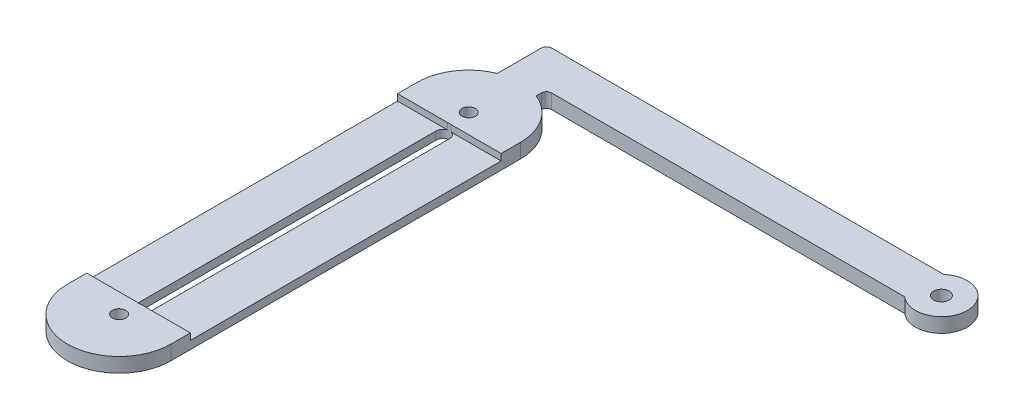
ISO-10303-21;
HEADER;
FILE_DESCRIPTION(('STEP AP214'),'2;1');
FILE_NAME('part.step','',(''),(''),'','','');
FILE_SCHEMA(('AUTOMOTIVE_DESIGN { 1 0 10303 214 1 1 1 1 }'));
ENDSEC;
DATA;
#1=APPLICATION_CONTEXT('core data for automotive mechanical design processes');
#2=APPLICATION_PROTOCOL_DEFINITION('international standard','automotive_design',2000,#1);
#3=PRODUCT_CONTEXT('',#1,'mechanical');
#4=PRODUCT('Part','Part','',(#3));
#5=PRODUCT_RELATED_PRODUCT_CATEGORY('part','',(#4));
#6=PRODUCT_DEFINITION_FORMATION('','',#4);
#7=PRODUCT_DEFINITION_CONTEXT('part definition',#1,'design');
#8=PRODUCT_DEFINITION('design','',#6,#7);
#9=PRODUCT_DEFINITION_SHAPE('','',#8);
#10=(LENGTH_UNIT() NAMED_UNIT(*) SI_UNIT(.MILLI.,.METRE.));
#11=(NAMED_UNIT(*) PLANE_ANGLE_UNIT() SI_UNIT($,.RADIAN.));
#12=(NAMED_UNIT(*) SI_UNIT($,.STERADIAN.) SOLID_ANGLE_UNIT());
#13=UNCERTAINTY_MEASURE_WITH_UNIT(LENGTH_MEASURE(1.E-05),#10,'distance_accuracy_value','');
#14=(GEOMETRIC_REPRESENTATION_CONTEXT(3) GLOBAL_UNCERTAINTY_ASSIGNED_CONTEXT((#13)) GLOBAL_UNIT_ASSIGNED_CONTEXT((#10,
#11,#12)) REPRESENTATION_CONTEXT('',''));
#15=CARTESIAN_POINT('',(0.,0.,0.));
#16=DIRECTION('',(0.,0.,1.));
#17=DIRECTION('',(1.,0.,0.));
#18=AXIS2_PLACEMENT_3D('',#15,#16,#17);
#19=CARTESIAN_POINT('',(0.,7.112,-85.725));
#20=DIRECTION('',(0.,-1.,0.));
#21=DIRECTION('',(0.,0.,-1.));
#22=AXIS2_PLACEMENT_3D('',#19,#20,#21);
#23=CYLINDRICAL_SURFACE('',#22,25.4);
#24=DIRECTION('',(0.,-1.,0.));
#25=VECTOR('',#24,1.);
#26=CARTESIAN_POINT('',(-9.52500000000002,7.112,-109.271430196529));
#27=LINE('',#26,#25);
#28=CARTESIAN_POINT('',(-9.52500000000002,0.,-109.271430196529));
#29=VERTEX_POINT('',#28);
#30=CARTESIAN_POINT('',(-9.52500000000002,7.112,-109.271430196529));
#31=VERTEX_POINT('',#30);
#32=EDGE_CURVE('E411',#29,#31,#27,.F.);
#33=ORIENTED_EDGE('',*,*,#32,.F.);
#34=CARTESIAN_POINT('',(0.,0.,-85.725));
#35=DIRECTION('',(0.,1.,0.));
#36=DIRECTION('',(0.,0.,1.));
#37=AXIS2_PLACEMENT_3D('',#34,#35,#36);
#38=CIRCLE('',#37,25.4);
#39=CARTESIAN_POINT('',(-25.4,0.,-85.725));
#40=VERTEX_POINT('',#39);
#41=EDGE_CURVE('E344',#29,#40,#38,.T.);
#42=ORIENTED_EDGE('',*,*,#41,.T.);
#43=DIRECTION('',(0.,-1.,0.));
#44=VECTOR('',#43,1.);
#45=CARTESIAN_POINT('',(-25.4,7.112,-85.725));
#46=LINE('',#45,#44);
#47=CARTESIAN_POINT('',(-25.4,7.112,-85.725));
#48=VERTEX_POINT('',#47);
#49=EDGE_CURVE('E388',#48,#40,#46,.T.);
#50=ORIENTED_EDGE('',*,*,#49,.F.);
#51=CARTESIAN_POINT('',(0.,7.112,-85.725));
#52=DIRECTION('',(0.,1.,0.));
#53=DIRECTION('',(0.,0.,1.));
#54=AXIS2_PLACEMENT_3D('',#51,#52,#53);
#55=CIRCLE('',#54,25.4);
#56=EDGE_CURVE('E350',#31,#48,#55,.T.);
#57=ORIENTED_EDGE('',*,*,#56,.F.);
#58=EDGE_LOOP('',(#33,#42,#50,#57));
#59=FACE_BOUND('',#58,.T.);
#60=ADVANCED_FACE('F39',(#59),#23,.T.);
#61=DIRECTION('',(0.,-1.,0.));
#62=VECTOR('',#61,1.);
#63=CARTESIAN_POINT('',(9.52500000000001,7.112,-109.271430196529));
#64=LINE('',#63,#62);
#65=CARTESIAN_POINT('',(9.52500000000001,7.112,-109.271430196529));
#66=VERTEX_POINT('',#65);
#67=CARTESIAN_POINT('',(9.52500000000001,0.,-109.271430196529));
#68=VERTEX_POINT('',#67);
#69=EDGE_CURVE('E408',#66,#68,#64,.T.);
#70=ORIENTED_EDGE('',*,*,#69,.F.);
#71=CARTESIAN_POINT('',(25.4,7.112,-85.725));
#72=VERTEX_POINT('',#71);
#73=EDGE_CURVE('E345',#72,#66,#55,.T.);
#74=ORIENTED_EDGE('',*,*,#73,.F.);
#75=DIRECTION('',(0.,-1.,0.));
#76=VECTOR('',#75,1.);
#77=CARTESIAN_POINT('',(25.4,7.112,-85.725));
#78=LINE('',#77,#76);
#79=CARTESIAN_POINT('',(25.4,0.,-85.725));
#80=VERTEX_POINT('',#79);
#81=EDGE_CURVE('E363',#72,#80,#78,.T.);
#82=ORIENTED_EDGE('',*,*,#81,.T.);
#83=EDGE_CURVE('E364',#80,#68,#38,.T.);
#84=ORIENTED_EDGE('',*,*,#83,.T.);
#85=EDGE_LOOP('',(#70,#74,#82,#84));
#86=FACE_BOUND('',#85,.T.);
#87=ADVANCED_FACE('F541',(#86),#23,.T.);
#88=CARTESIAN_POINT('',(0.,7.112,-85.725));
#89=DIRECTION('',(0.,1.,0.));
#90=DIRECTION('',(0.,0.,1.));
#91=AXIS2_PLACEMENT_3D('',#88,#89,#90);
#92=PLANE('',#91);
#93=DIRECTION('',(1.,0.,0.));
#94=VECTOR('',#93,1.);
#95=CARTESIAN_POINT('',(25.4,7.112,76.2));
#96=LINE('',#95,#94);
#97=CARTESIAN_POINT('',(-25.4,7.112,76.2));
#98=VERTEX_POINT('',#97);
#99=CARTESIAN_POINT('',(-0.906961410424909,7.112,76.2));
#100=VERTEX_POINT('',#99);
#101=EDGE_CURVE('E249',#98,#100,#96,.T.);
#102=ORIENTED_EDGE('',*,*,#101,.F.);
#103=DIRECTION('',(0.,0.,1.));
#104=VECTOR('',#103,1.);
#105=CARTESIAN_POINT('',(-25.4,7.112,-85.725));
#106=LINE('',#105,#104);
#107=CARTESIAN_POINT('',(-25.4,7.112,85.725));
#108=VERTEX_POINT('',#107);
#109=EDGE_CURVE('E349',#98,#108,#106,.T.);
#110=ORIENTED_EDGE('',*,*,#109,.T.);
#111=CARTESIAN_POINT('',(0.,7.112,85.725));
#112=DIRECTION('',(0.,1.,0.));
#113=DIRECTION('',(0.,0.,1.));
#114=AXIS2_PLACEMENT_3D('',#111,#112,#113);
#115=CIRCLE('',#114,25.4);
#116=CARTESIAN_POINT('',(25.4,7.112,85.725));
#117=VERTEX_POINT('',#116);
#118=EDGE_CURVE('E355',#108,#117,#115,.T.);
#119=ORIENTED_EDGE('',*,*,#118,.T.);
#120=DIRECTION('',(0.,0.,-1.));
#121=VECTOR('',#120,1.);
#122=CARTESIAN_POINT('',(25.4,7.112,-85.725));
#123=LINE('',#122,#121);
#124=CARTESIAN_POINT('',(25.4,7.112,76.2));
#125=VERTEX_POINT('',#124);
#126=EDGE_CURVE('E359',#117,#125,#123,.T.);
#127=ORIENTED_EDGE('',*,*,#126,.T.);
#128=CARTESIAN_POINT('',(0.906961410424944,7.112,76.2));
#129=VERTEX_POINT('',#128);
#130=EDGE_CURVE('E265',#129,#125,#96,.T.);
#131=ORIENTED_EDGE('',*,*,#130,.F.);
#132=CARTESIAN_POINT('',(0.,7.112,73.025));
#133=DIRECTION('',(0.,1.,0.));
#134=DIRECTION('',(0.,0.,1.));
#135=AXIS2_PLACEMENT_3D('',#132,#133,#134);
#136=CIRCLE('',#135,3.302);
#137=EDGE_CURVE('E313',#100,#129,#136,.T.);
#138=ORIENTED_EDGE('',*,*,#137,.F.);
#139=EDGE_LOOP('',(#102,#110,#119,#127,#131,#138));
#140=FACE_BOUND('',#139,.T.);
#141=CARTESIAN_POINT('',(0.,7.112,85.725));
#142=DIRECTION('',(0.,1.,0.));
#143=DIRECTION('',(0.,0.,1.));
#144=AXIS2_PLACEMENT_3D('',#141,#142,#143);
#145=CIRCLE('',#144,3.302);
#146=CARTESIAN_POINT('',(0.,7.112,89.027));
#147=VERTEX_POINT('',#146);
#148=EDGE_CURVE('E301',#147,#147,#145,.T.);
#149=ORIENTED_EDGE('',*,*,#148,.F.);
#150=EDGE_LOOP('',(#149));
#151=FACE_BOUND('',#150,.T.);
#152=ADVANCED_FACE('F470',(#140,#151),#92,.T.);
#153=DIRECTION('',(-1.,0.,0.));
#154=VECTOR('',#153,1.);
#155=CARTESIAN_POINT('',(-9.52500000000002,7.11200000000001,-133.35));
#156=LINE('',#155,#154);
#157=CARTESIAN_POINT('',(185.27473958737,7.11200000000001,-133.35));
#158=VERTEX_POINT('',#157);
#159=CARTESIAN_POINT('',(-6.98500000000002,7.11200000000001,-133.35));
#160=VERTEX_POINT('',#159);
#161=EDGE_CURVE('E454',#158,#160,#156,.T.);
#162=ORIENTED_EDGE('',*,*,#161,.T.);
#163=CARTESIAN_POINT('',(-6.98500000000002,7.11200000000001,-130.81));
#164=DIRECTION('',(0.,1.,0.));
#165=DIRECTION('',(0.,0.,1.));
#166=AXIS2_PLACEMENT_3D('',#163,#164,#165);
#167=CIRCLE('',#166,2.54);
#168=CARTESIAN_POINT('',(-9.52500000000002,7.11200000000001,-130.81));
#169=VERTEX_POINT('',#168);
#170=EDGE_CURVE('E428',#160,#169,#167,.T.);
#171=ORIENTED_EDGE('',*,*,#170,.T.);
#172=DIRECTION('',(0.,0.,1.));
#173=VECTOR('',#172,1.);
#174=CARTESIAN_POINT('',(-9.52500000000002,7.11200000000001,-85.725));
#175=LINE('',#174,#173);
#176=EDGE_CURVE('E243',#169,#31,#175,.T.);
#177=ORIENTED_EDGE('',*,*,#176,.T.);
#178=ORIENTED_EDGE('',*,*,#56,.T.);
#179=CARTESIAN_POINT('',(-25.4,7.112,-76.2));
#180=VERTEX_POINT('',#179);
#181=EDGE_CURVE('E351',#48,#180,#106,.T.);
#182=ORIENTED_EDGE('',*,*,#181,.T.);
#183=DIRECTION('',(-1.,0.,0.));
#184=VECTOR('',#183,1.);
#185=CARTESIAN_POINT('',(25.4,7.112,-76.2));
#186=LINE('',#185,#184);
#187=CARTESIAN_POINT('',(-0.906961410424953,7.112,-76.2));
#188=VERTEX_POINT('',#187);
#189=EDGE_CURVE('E222',#188,#180,#186,.T.);
#190=ORIENTED_EDGE('',*,*,#189,.F.);
#191=CARTESIAN_POINT('',(0.,7.112,-73.025));
#192=DIRECTION('',(0.,1.,0.));
#193=DIRECTION('',(0.,0.,1.));
#194=AXIS2_PLACEMENT_3D('',#191,#192,#193);
#195=CIRCLE('',#194,3.302);
#196=CARTESIAN_POINT('',(0.906961410424899,7.112,-76.2));
#197=VERTEX_POINT('',#196);
#198=EDGE_CURVE('E309',#197,#188,#195,.T.);
#199=ORIENTED_EDGE('',*,*,#198,.F.);
#200=CARTESIAN_POINT('',(25.4,7.112,-76.2));
#201=VERTEX_POINT('',#200);
#202=EDGE_CURVE('E262',#201,#197,#186,.T.);
#203=ORIENTED_EDGE('',*,*,#202,.F.);
#204=EDGE_CURVE('E358',#201,#72,#123,.T.);
#205=ORIENTED_EDGE('',*,*,#204,.T.);
#206=ORIENTED_EDGE('',*,*,#73,.T.);
#207=DIRECTION('',(0.,0.,-1.));
#208=VECTOR('',#207,1.);
#209=CARTESIAN_POINT('',(9.52500000000001,7.11200000000001,-114.3));
#210=LINE('',#209,#208);
#211=CARTESIAN_POINT('',(9.52500000000001,7.11200000000001,-111.76));
#212=VERTEX_POINT('',#211);
#213=EDGE_CURVE('E448',#66,#212,#210,.T.);
#214=ORIENTED_EDGE('',*,*,#213,.T.);
#215=CARTESIAN_POINT('',(12.065,7.11200000000001,-111.76));
#216=DIRECTION('',(0.,1.,0.));
#217=DIRECTION('',(0.,0.,1.));
#218=AXIS2_PLACEMENT_3D('',#215,#216,#217);
#219=CIRCLE('',#218,2.54);
#220=CARTESIAN_POINT('',(12.065,7.11200000000001,-114.3));
#221=VERTEX_POINT('',#220);
#222=EDGE_CURVE('E11',#212,#221,#219,.F.);
#223=ORIENTED_EDGE('',*,*,#222,.T.);
#224=DIRECTION('',(1.,0.,0.));
#225=VECTOR('',#224,1.);
#226=CARTESIAN_POINT('',(185.27473958737,7.11200000000001,-114.3));
#227=LINE('',#226,#225);
#228=CARTESIAN_POINT('',(185.27473958737,7.11200000000001,-114.3));
#229=VERTEX_POINT('',#228);
#230=EDGE_CURVE('E447',#221,#229,#227,.T.);
#231=ORIENTED_EDGE('',*,*,#230,.T.);
#232=CARTESIAN_POINT('',(193.675,7.11200000000001,-123.825));
#233=DIRECTION('',(0.,1.,0.));
#234=DIRECTION('',(0.,0.,1.));
#235=AXIS2_PLACEMENT_3D('',#232,#233,#234);
#236=CIRCLE('',#235,12.7);
#237=EDGE_CURVE('E220',#229,#158,#236,.T.);
#238=ORIENTED_EDGE('',*,*,#237,.T.);
#239=EDGE_LOOP('',(#162,#171,#177,#178,#182,#190,#199,#203,#205,#206,#214,#223,#231,#238));
#240=FACE_BOUND('',#239,.T.);
#241=CARTESIAN_POINT('',(193.675,7.11200000000001,-123.825));
#242=DIRECTION('',(0.,1.,0.));
#243=DIRECTION('',(0.,0.,1.));
#244=AXIS2_PLACEMENT_3D('',#241,#242,#243);
#245=CIRCLE('',#244,3.81000000000001);
#246=CARTESIAN_POINT('',(193.675,7.11200000000001,-120.015));
#247=VERTEX_POINT('',#246);
#248=EDGE_CURVE('E239',#247,#247,#245,.T.);
#249=ORIENTED_EDGE('',*,*,#248,.F.);
#250=EDGE_LOOP('',(#249));
#251=FACE_BOUND('',#250,.T.);
#252=CARTESIAN_POINT('',(0.,7.112,-85.725));
#253=DIRECTION('',(0.,1.,0.));
#254=DIRECTION('',(0.,0.,1.));
#255=AXIS2_PLACEMENT_3D('',#252,#253,#254);
#256=CIRCLE('',#255,3.302);
#257=CARTESIAN_POINT('',(0.,7.112,-82.423));
#258=VERTEX_POINT('',#257);
#259=EDGE_CURVE('E292',#258,#258,#256,.T.);
#260=ORIENTED_EDGE('',*,*,#259,.F.);
#261=EDGE_LOOP('',(#260));
#262=FACE_BOUND('',#261,.T.);
#263=ADVANCED_FACE('F445',(#240,#251,#262),#92,.T.);
#264=CARTESIAN_POINT('',(0.,0.,-85.725));
#265=DIRECTION('',(0.,1.,0.));
#266=DIRECTION('',(0.,0.,1.));
#267=AXIS2_PLACEMENT_3D('',#264,#265,#266);
#268=PLANE('',#267);
#269=DIRECTION('',(0.,0.,1.));
#270=VECTOR('',#269,1.);
#271=CARTESIAN_POINT('',(-9.52500000000002,0.,-85.725));
#272=LINE('',#271,#270);
#273=CARTESIAN_POINT('',(-9.52500000000002,0.,-130.81));
#274=VERTEX_POINT('',#273);
#275=EDGE_CURVE('E231',#274,#29,#272,.T.);
#276=ORIENTED_EDGE('',*,*,#275,.F.);
#277=CARTESIAN_POINT('',(-6.98500000000002,0.,-130.81));
#278=DIRECTION('',(0.,1.,0.));
#279=DIRECTION('',(0.,0.,1.));
#280=AXIS2_PLACEMENT_3D('',#277,#278,#279);
#281=CIRCLE('',#280,2.54);
#282=CARTESIAN_POINT('',(-6.98500000000002,0.,-133.35));
#283=VERTEX_POINT('',#282);
#284=EDGE_CURVE('E63',#274,#283,#281,.F.);
#285=ORIENTED_EDGE('',*,*,#284,.T.);
#286=DIRECTION('',(-1.,0.,0.));
#287=VECTOR('',#286,1.);
#288=CARTESIAN_POINT('',(-9.52500000000002,0.,-133.35));
#289=LINE('',#288,#287);
#290=CARTESIAN_POINT('',(185.27473958737,0.,-133.35));
#291=VERTEX_POINT('',#290);
#292=EDGE_CURVE('E227',#291,#283,#289,.T.);
#293=ORIENTED_EDGE('',*,*,#292,.F.);
#294=CARTESIAN_POINT('',(193.675,0.,-123.825));
#295=DIRECTION('',(0.,1.,0.));
#296=DIRECTION('',(0.,0.,1.));
#297=AXIS2_PLACEMENT_3D('',#294,#295,#296);
#298=CIRCLE('',#297,12.7);
#299=CARTESIAN_POINT('',(185.27473958737,0.,-114.3));
#300=VERTEX_POINT('',#299);
#301=EDGE_CURVE('E211',#300,#291,#298,.T.);
#302=ORIENTED_EDGE('',*,*,#301,.F.);
#303=DIRECTION('',(1.,0.,0.));
#304=VECTOR('',#303,1.);
#305=CARTESIAN_POINT('',(185.27473958737,0.,-114.3));
#306=LINE('',#305,#304);
#307=CARTESIAN_POINT('',(12.0650000000001,0.,-114.3));
#308=VERTEX_POINT('',#307);
#309=EDGE_CURVE('E202',#308,#300,#306,.T.);
#310=ORIENTED_EDGE('',*,*,#309,.F.);
#311=CARTESIAN_POINT('',(12.065,0.,-111.76));
#312=DIRECTION('',(0.,1.,0.));
#313=DIRECTION('',(0.,0.,1.));
#314=AXIS2_PLACEMENT_3D('',#311,#312,#313);
#315=CIRCLE('',#314,2.54);
#316=CARTESIAN_POINT('',(9.52500000000001,0.,-111.76));
#317=VERTEX_POINT('',#316);
#318=EDGE_CURVE('E48',#308,#317,#315,.T.);
#319=ORIENTED_EDGE('',*,*,#318,.T.);
#320=DIRECTION('',(0.,0.,-1.));
#321=VECTOR('',#320,1.);
#322=CARTESIAN_POINT('',(9.52500000000001,0.,-114.3));
#323=LINE('',#322,#321);
#324=EDGE_CURVE('E212',#68,#317,#323,.T.);
#325=ORIENTED_EDGE('',*,*,#324,.F.);
#326=ORIENTED_EDGE('',*,*,#83,.F.);
#327=DIRECTION('',(0.,0.,-1.));
#328=VECTOR('',#327,1.);
#329=CARTESIAN_POINT('',(25.4,0.,-85.725));
#330=LINE('',#329,#328);
#331=CARTESIAN_POINT('',(25.4,0.,85.725));
#332=VERTEX_POINT('',#331);
#333=EDGE_CURVE('E374',#332,#80,#330,.T.);
#334=ORIENTED_EDGE('',*,*,#333,.F.);
#335=CARTESIAN_POINT('',(0.,0.,85.725));
#336=DIRECTION('',(0.,1.,0.));
#337=DIRECTION('',(0.,0.,1.));
#338=AXIS2_PLACEMENT_3D('',#335,#336,#337);
#339=CIRCLE('',#338,25.4);
#340=CARTESIAN_POINT('',(-25.4,0.,85.725));
#341=VERTEX_POINT('',#340);
#342=EDGE_CURVE('E371',#341,#332,#339,.T.);
#343=ORIENTED_EDGE('',*,*,#342,.F.);
#344=DIRECTION('',(0.,0.,1.));
#345=VECTOR('',#344,1.);
#346=CARTESIAN_POINT('',(-25.4,0.,-85.725));
#347=LINE('',#346,#345);
#348=EDGE_CURVE('E368',#40,#341,#347,.T.);
#349=ORIENTED_EDGE('',*,*,#348,.F.);
#350=ORIENTED_EDGE('',*,*,#41,.F.);
#351=EDGE_LOOP('',(#276,#285,#293,#302,#310,#319,#325,#326,#334,#343,#349,#350));
#352=FACE_BOUND('',#351,.T.);
#353=CARTESIAN_POINT('',(193.675,0.,-123.825));
#354=DIRECTION('',(0.,1.,0.));
#355=DIRECTION('',(0.,0.,1.));
#356=AXIS2_PLACEMENT_3D('',#353,#354,#355);
#357=CIRCLE('',#356,3.81000000000001);
#358=CARTESIAN_POINT('',(193.675,0.,-120.015));
#359=VERTEX_POINT('',#358);
#360=EDGE_CURVE('E441',#359,#359,#357,.T.);
#361=ORIENTED_EDGE('',*,*,#360,.T.);
#362=EDGE_LOOP('',(#361));
#363=FACE_BOUND('',#362,.T.);
#364=CARTESIAN_POINT('',(0.,0.,-85.725));
#365=DIRECTION('',(0.,1.,0.));
#366=DIRECTION('',(0.,0.,1.));
#367=AXIS2_PLACEMENT_3D('',#364,#365,#366);
#368=CIRCLE('',#367,3.302);
#369=CARTESIAN_POINT('',(0.,0.,-82.423));
#370=VERTEX_POINT('',#369);
#371=EDGE_CURVE('E297',#370,#370,#368,.T.);
#372=ORIENTED_EDGE('',*,*,#371,.T.);
#373=EDGE_LOOP('',(#372));
#374=FACE_BOUND('',#373,.T.);
#375=CARTESIAN_POINT('',(0.,0.,85.725));
#376=DIRECTION('',(0.,1.,0.));
#377=DIRECTION('',(0.,0.,1.));
#378=AXIS2_PLACEMENT_3D('',#375,#376,#377);
#379=CIRCLE('',#378,3.302);
#380=CARTESIAN_POINT('',(0.,0.,89.027));
#381=VERTEX_POINT('',#380);
#382=EDGE_CURVE('E296',#381,#381,#379,.T.);
#383=ORIENTED_EDGE('',*,*,#382,.T.);
#384=EDGE_LOOP('',(#383));
#385=FACE_BOUND('',#384,.T.);
#386=CARTESIAN_POINT('',(0.,0.,-73.025));
#387=DIRECTION('',(0.,1.,0.));
#388=DIRECTION('',(0.,0.,1.));
#389=AXIS2_PLACEMENT_3D('',#386,#387,#388);
#390=CIRCLE('',#389,3.302);
#391=CARTESIAN_POINT('',(3.30199999999997,0.,-73.025));
#392=VERTEX_POINT('',#391);
#393=CARTESIAN_POINT('',(-3.30200000000002,0.,-73.025));
#394=VERTEX_POINT('',#393);
#395=EDGE_CURVE('E305',#392,#394,#390,.T.);
#396=ORIENTED_EDGE('',*,*,#395,.T.);
#397=DIRECTION('',(0.,0.,1.));
#398=VECTOR('',#397,1.);
#399=CARTESIAN_POINT('',(-3.30200000000002,0.,-73.025));
#400=LINE('',#399,#398);
#401=CARTESIAN_POINT('',(-3.30199999999998,0.,73.025));
#402=VERTEX_POINT('',#401);
#403=EDGE_CURVE('E322',#394,#402,#400,.T.);
#404=ORIENTED_EDGE('',*,*,#403,.T.);
#405=CARTESIAN_POINT('',(0.,0.,73.025));
#406=DIRECTION('',(0.,1.,0.));
#407=DIRECTION('',(0.,0.,1.));
#408=AXIS2_PLACEMENT_3D('',#405,#406,#407);
#409=CIRCLE('',#408,3.302);
#410=CARTESIAN_POINT('',(3.30200000000002,0.,73.025));
#411=VERTEX_POINT('',#410);
#412=EDGE_CURVE('E326',#402,#411,#409,.T.);
#413=ORIENTED_EDGE('',*,*,#412,.T.);
#414=DIRECTION('',(0.,0.,-1.));
#415=VECTOR('',#414,1.);
#416=CARTESIAN_POINT('',(3.30199999999997,0.,-73.025));
#417=LINE('',#416,#415);
#418=EDGE_CURVE('E314',#411,#392,#417,.T.);
#419=ORIENTED_EDGE('',*,*,#418,.T.);
#420=EDGE_LOOP('',(#396,#404,#413,#419));
#421=FACE_BOUND('',#420,.T.);
#422=ADVANCED_FACE('F225',(#352,#363,#374,#385,#421),#268,.F.);
#423=CARTESIAN_POINT('',(-25.4,7.112,-85.725));
#424=DIRECTION('',(1.,0.,0.));
#425=DIRECTION('',(0.,0.,-1.));
#426=AXIS2_PLACEMENT_3D('',#423,#424,#425);
#427=PLANE('',#426);
#428=ORIENTED_EDGE('',*,*,#109,.F.);
#429=DIRECTION('',(0.,1.,0.));
#430=VECTOR('',#429,1.);
#431=CARTESIAN_POINT('',(-25.4,3.937,76.2));
#432=LINE('',#431,#430);
#433=CARTESIAN_POINT('',(-25.4,3.937,76.2));
#434=VERTEX_POINT('',#433);
#435=EDGE_CURVE('E273',#434,#98,#432,.T.);
#436=ORIENTED_EDGE('',*,*,#435,.F.);
#437=DIRECTION('',(0.,0.,1.));
#438=VECTOR('',#437,1.);
#439=CARTESIAN_POINT('',(-25.4,3.937,-76.2));
#440=LINE('',#439,#438);
#441=CARTESIAN_POINT('',(-25.4,3.937,-76.2));
#442=VERTEX_POINT('',#441);
#443=EDGE_CURVE('E254',#442,#434,#440,.T.);
#444=ORIENTED_EDGE('',*,*,#443,.F.);
#445=DIRECTION('',(0.,1.,0.));
#446=VECTOR('',#445,1.);
#447=CARTESIAN_POINT('',(-25.4,3.937,-76.2));
#448=LINE('',#447,#446);
#449=EDGE_CURVE('E276',#442,#180,#448,.T.);
#450=ORIENTED_EDGE('',*,*,#449,.T.);
#451=ORIENTED_EDGE('',*,*,#181,.F.);
#452=ORIENTED_EDGE('',*,*,#49,.T.);
#453=ORIENTED_EDGE('',*,*,#348,.T.);
#454=DIRECTION('',(0.,-1.,0.));
#455=VECTOR('',#454,1.);
#456=CARTESIAN_POINT('',(-25.4,7.112,85.725));
#457=LINE('',#456,#455);
#458=EDGE_CURVE('E384',#108,#341,#457,.T.);
#459=ORIENTED_EDGE('',*,*,#458,.F.);
#460=EDGE_LOOP('',(#428,#436,#444,#450,#451,#452,#453,#459));
#461=FACE_BOUND('',#460,.T.);
#462=ADVANCED_FACE('F483',(#461),#427,.F.);
#463=CARTESIAN_POINT('',(0.,7.112,85.725));
#464=DIRECTION('',(0.,-1.,0.));
#465=DIRECTION('',(0.,0.,-1.));
#466=AXIS2_PLACEMENT_3D('',#463,#464,#465);
#467=CYLINDRICAL_SURFACE('',#466,25.4);
#468=ORIENTED_EDGE('',*,*,#342,.T.);
#469=DIRECTION('',(0.,-1.,0.));
#470=VECTOR('',#469,1.);
#471=CARTESIAN_POINT('',(25.4,7.112,85.725));
#472=LINE('',#471,#470);
#473=EDGE_CURVE('E380',#117,#332,#472,.T.);
#474=ORIENTED_EDGE('',*,*,#473,.F.);
#475=ORIENTED_EDGE('',*,*,#118,.F.);
#476=ORIENTED_EDGE('',*,*,#458,.T.);
#477=EDGE_LOOP('',(#468,#474,#475,#476));
#478=FACE_BOUND('',#477,.T.);
#479=ADVANCED_FACE('F547',(#478),#467,.T.);
#480=CARTESIAN_POINT('',(25.4,7.112,-85.725));
#481=DIRECTION('',(-1.,0.,0.));
#482=DIRECTION('',(0.,0.,1.));
#483=AXIS2_PLACEMENT_3D('',#480,#481,#482);
#484=PLANE('',#483);
#485=DIRECTION('',(0.,0.,-1.));
#486=VECTOR('',#485,1.);
#487=CARTESIAN_POINT('',(25.4,3.937,-76.2));
#488=LINE('',#487,#486);
#489=CARTESIAN_POINT('',(25.4,3.937,76.2));
#490=VERTEX_POINT('',#489);
#491=CARTESIAN_POINT('',(25.4,3.937,-76.2));
#492=VERTEX_POINT('',#491);
#493=EDGE_CURVE('E244',#490,#492,#488,.T.);
#494=ORIENTED_EDGE('',*,*,#493,.F.);
#495=DIRECTION('',(0.,1.,0.));
#496=VECTOR('',#495,1.);
#497=CARTESIAN_POINT('',(25.4,3.937,76.2));
#498=LINE('',#497,#496);
#499=EDGE_CURVE('E268',#490,#125,#498,.T.);
#500=ORIENTED_EDGE('',*,*,#499,.T.);
#501=ORIENTED_EDGE('',*,*,#126,.F.);
#502=ORIENTED_EDGE('',*,*,#473,.T.);
#503=ORIENTED_EDGE('',*,*,#333,.T.);
#504=ORIENTED_EDGE('',*,*,#81,.F.);
#505=ORIENTED_EDGE('',*,*,#204,.F.);
#506=DIRECTION('',(0.,1.,0.));
#507=VECTOR('',#506,1.);
#508=CARTESIAN_POINT('',(25.4,3.937,-76.2));
#509=LINE('',#508,#507);
#510=EDGE_CURVE('E261',#492,#201,#509,.T.);
#511=ORIENTED_EDGE('',*,*,#510,.F.);
#512=EDGE_LOOP('',(#494,#500,#501,#502,#503,#504,#505,#511));
#513=FACE_BOUND('',#512,.T.);
#514=ADVANCED_FACE('F538',(#513),#484,.F.);
#515=CARTESIAN_POINT('',(0.,7.112,-73.025));
#516=DIRECTION('',(0.,-1.,0.));
#517=DIRECTION('',(0.,0.,-1.));
#518=AXIS2_PLACEMENT_3D('',#515,#516,#517);
#519=CYLINDRICAL_SURFACE('',#518,3.302);
#520=DIRECTION('',(0.,-1.,0.));
#521=VECTOR('',#520,1.);
#522=CARTESIAN_POINT('',(0.906961410424924,7.112,-76.2));
#523=LINE('',#522,#521);
#524=CARTESIAN_POINT('',(0.906961410424899,3.937,-76.2));
#525=VERTEX_POINT('',#524);
#526=EDGE_CURVE('E405',#197,#525,#523,.T.);
#527=ORIENTED_EDGE('',*,*,#526,.F.);
#528=ORIENTED_EDGE('',*,*,#198,.T.);
#529=DIRECTION('',(0.,-1.,0.));
#530=VECTOR('',#529,1.);
#531=CARTESIAN_POINT('',(-0.906961410424977,7.112,-76.2));
#532=LINE('',#531,#530);
#533=CARTESIAN_POINT('',(-0.906961410424953,3.937,-76.2));
#534=VERTEX_POINT('',#533);
#535=EDGE_CURVE('E402',#534,#188,#532,.F.);
#536=ORIENTED_EDGE('',*,*,#535,.F.);
#537=CARTESIAN_POINT('',(0.,3.937,-73.025));
#538=DIRECTION('',(0.,-1.,0.));
#539=DIRECTION('',(0.,0.,-1.));
#540=AXIS2_PLACEMENT_3D('',#537,#538,#539);
#541=CIRCLE('',#540,3.302);
#542=CARTESIAN_POINT('',(-3.30200000000002,3.937,-73.025));
#543=VERTEX_POINT('',#542);
#544=EDGE_CURVE('E288',#543,#534,#541,.T.);
#545=ORIENTED_EDGE('',*,*,#544,.F.);
#546=DIRECTION('',(0.,-1.,0.));
#547=VECTOR('',#546,1.);
#548=CARTESIAN_POINT('',(-3.30200000000002,7.112,-73.025));
#549=LINE('',#548,#547);
#550=EDGE_CURVE('E341',#543,#394,#549,.T.);
#551=ORIENTED_EDGE('',*,*,#550,.T.);
#552=ORIENTED_EDGE('',*,*,#395,.F.);
#553=DIRECTION('',(0.,-1.,0.));
#554=VECTOR('',#553,1.);
#555=CARTESIAN_POINT('',(3.30199999999997,7.112,-73.025));
#556=LINE('',#555,#554);
#557=CARTESIAN_POINT('',(3.30199999999997,3.937,-73.025));
#558=VERTEX_POINT('',#557);
#559=EDGE_CURVE('E318',#558,#392,#556,.T.);
#560=ORIENTED_EDGE('',*,*,#559,.F.);
#561=EDGE_CURVE('E284',#525,#558,#541,.T.);
#562=ORIENTED_EDGE('',*,*,#561,.F.);
#563=EDGE_LOOP('',(#527,#528,#536,#545,#551,#552,#560,#562));
#564=FACE_BOUND('',#563,.T.);
#565=ADVANCED_FACE('F493',(#564),#519,.F.);
#566=CARTESIAN_POINT('',(-3.30200000000002,7.112,-73.025));
#567=DIRECTION('',(1.,0.,0.));
#568=DIRECTION('',(0.,0.,-1.));
#569=AXIS2_PLACEMENT_3D('',#566,#567,#568);
#570=PLANE('',#569);
#571=DIRECTION('',(0.,0.,-1.));
#572=VECTOR('',#571,1.);
#573=CARTESIAN_POINT('',(-3.30200000000002,3.937,-73.025));
#574=LINE('',#573,#572);
#575=CARTESIAN_POINT('',(-3.30199999999998,3.937,73.025));
#576=VERTEX_POINT('',#575);
#577=EDGE_CURVE('E289',#576,#543,#574,.T.);
#578=ORIENTED_EDGE('',*,*,#577,.F.);
#579=DIRECTION('',(0.,-1.,0.));
#580=VECTOR('',#579,1.);
#581=CARTESIAN_POINT('',(-3.30199999999998,7.112,73.025));
#582=LINE('',#581,#580);
#583=EDGE_CURVE('E338',#576,#402,#582,.T.);
#584=ORIENTED_EDGE('',*,*,#583,.T.);
#585=ORIENTED_EDGE('',*,*,#403,.F.);
#586=ORIENTED_EDGE('',*,*,#550,.F.);
#587=EDGE_LOOP('',(#578,#584,#585,#586));
#588=FACE_BOUND('',#587,.T.);
#589=ADVANCED_FACE('F500',(#588),#570,.T.);
#590=CARTESIAN_POINT('',(0.,7.112,73.025));
#591=DIRECTION('',(0.,-1.,0.));
#592=DIRECTION('',(0.,0.,-1.));
#593=AXIS2_PLACEMENT_3D('',#590,#591,#592);
#594=CYLINDRICAL_SURFACE('',#593,3.302);
#595=DIRECTION('',(0.,-1.,0.));
#596=VECTOR('',#595,1.);
#597=CARTESIAN_POINT('',(-0.906961410424933,7.112,76.2));
#598=LINE('',#597,#596);
#599=CARTESIAN_POINT('',(-0.906961410424909,3.937,76.2));
#600=VERTEX_POINT('',#599);
#601=EDGE_CURVE('E398',#100,#600,#598,.T.);
#602=ORIENTED_EDGE('',*,*,#601,.F.);
#603=ORIENTED_EDGE('',*,*,#137,.T.);
#604=DIRECTION('',(0.,-1.,0.));
#605=VECTOR('',#604,1.);
#606=CARTESIAN_POINT('',(0.906961410424968,7.112,76.2));
#607=LINE('',#606,#605);
#608=CARTESIAN_POINT('',(0.906961410424944,3.937,76.2));
#609=VERTEX_POINT('',#608);
#610=EDGE_CURVE('E395',#609,#129,#607,.F.);
#611=ORIENTED_EDGE('',*,*,#610,.F.);
#612=CARTESIAN_POINT('',(0.,3.937,73.025));
#613=DIRECTION('',(0.,-1.,0.));
#614=DIRECTION('',(0.,0.,-1.));
#615=AXIS2_PLACEMENT_3D('',#612,#613,#614);
#616=CIRCLE('',#615,3.302);
#617=CARTESIAN_POINT('',(3.30200000000002,3.937,73.025));
#618=VERTEX_POINT('',#617);
#619=EDGE_CURVE('E272',#618,#609,#616,.T.);
#620=ORIENTED_EDGE('',*,*,#619,.F.);
#621=DIRECTION('',(0.,-1.,0.));
#622=VECTOR('',#621,1.);
#623=CARTESIAN_POINT('',(3.30200000000002,7.112,73.025));
#624=LINE('',#623,#622);
#625=EDGE_CURVE('E335',#618,#411,#624,.T.);
#626=ORIENTED_EDGE('',*,*,#625,.T.);
#627=ORIENTED_EDGE('',*,*,#412,.F.);
#628=ORIENTED_EDGE('',*,*,#583,.F.);
#629=EDGE_CURVE('E285',#600,#576,#616,.T.);
#630=ORIENTED_EDGE('',*,*,#629,.F.);
#631=EDGE_LOOP('',(#602,#603,#611,#620,#626,#627,#628,#630));
#632=FACE_BOUND('',#631,.T.);
#633=ADVANCED_FACE('F506',(#632),#594,.F.);
#634=CARTESIAN_POINT('',(3.30199999999997,7.112,-73.025));
#635=DIRECTION('',(-1.,0.,0.));
#636=DIRECTION('',(0.,0.,1.));
#637=AXIS2_PLACEMENT_3D('',#634,#635,#636);
#638=PLANE('',#637);
#639=DIRECTION('',(0.,0.,1.));
#640=VECTOR('',#639,1.);
#641=CARTESIAN_POINT('',(3.30199999999997,3.937,-73.025));
#642=LINE('',#641,#640);
#643=EDGE_CURVE('E392',#558,#618,#642,.T.);
#644=ORIENTED_EDGE('',*,*,#643,.F.);
#645=ORIENTED_EDGE('',*,*,#559,.T.);
#646=ORIENTED_EDGE('',*,*,#418,.F.);
#647=ORIENTED_EDGE('',*,*,#625,.F.);
#648=EDGE_LOOP('',(#644,#645,#646,#647));
#649=FACE_BOUND('',#648,.T.);
#650=ADVANCED_FACE('F512',(#649),#638,.T.);
#651=CARTESIAN_POINT('',(0.,7.112,85.725));
#652=DIRECTION('',(0.,-1.,0.));
#653=DIRECTION('',(0.,0.,-1.));
#654=AXIS2_PLACEMENT_3D('',#651,#652,#653);
#655=CYLINDRICAL_SURFACE('',#654,3.302);
#656=ORIENTED_EDGE('',*,*,#148,.T.);
#657=EDGE_LOOP('',(#656));
#658=FACE_BOUND('',#657,.T.);
#659=ORIENTED_EDGE('',*,*,#382,.F.);
#660=EDGE_LOOP('',(#659));
#661=FACE_BOUND('',#660,.T.);
#662=ADVANCED_FACE('F478',(#658,#661),#655,.F.);
#663=CARTESIAN_POINT('',(0.,7.112,-85.725));
#664=DIRECTION('',(0.,-1.,0.));
#665=DIRECTION('',(0.,0.,-1.));
#666=AXIS2_PLACEMENT_3D('',#663,#664,#665);
#667=CYLINDRICAL_SURFACE('',#666,3.302);
#668=ORIENTED_EDGE('',*,*,#259,.T.);
#669=EDGE_LOOP('',(#668));
#670=FACE_BOUND('',#669,.T.);
#671=ORIENTED_EDGE('',*,*,#371,.F.);
#672=EDGE_LOOP('',(#671));
#673=FACE_BOUND('',#672,.T.);
#674=ADVANCED_FACE('F474',(#670,#673),#667,.F.);
#675=CARTESIAN_POINT('',(0.,3.937,0.));
#676=DIRECTION('',(0.,-1.,0.));
#677=DIRECTION('',(0.,0.,-1.));
#678=AXIS2_PLACEMENT_3D('',#675,#676,#677);
#679=PLANE('',#678);
#680=ORIENTED_EDGE('',*,*,#561,.T.);
#681=ORIENTED_EDGE('',*,*,#643,.T.);
#682=ORIENTED_EDGE('',*,*,#619,.T.);
#683=DIRECTION('',(1.,0.,0.));
#684=VECTOR('',#683,1.);
#685=CARTESIAN_POINT('',(25.4,3.937,76.2));
#686=LINE('',#685,#684);
#687=EDGE_CURVE('E257',#609,#490,#686,.T.);
#688=ORIENTED_EDGE('',*,*,#687,.T.);
#689=ORIENTED_EDGE('',*,*,#493,.T.);
#690=DIRECTION('',(-1.,0.,0.));
#691=VECTOR('',#690,1.);
#692=CARTESIAN_POINT('',(25.4,3.937,-76.2));
#693=LINE('',#692,#691);
#694=EDGE_CURVE('E250',#492,#525,#693,.T.);
#695=ORIENTED_EDGE('',*,*,#694,.T.);
#696=EDGE_LOOP('',(#680,#681,#682,#688,#689,#695));
#697=FACE_BOUND('',#696,.T.);
#698=ADVANCED_FACE('F477',(#697),#679,.F.);
#699=CARTESIAN_POINT('',(25.4,3.937,76.2));
#700=DIRECTION('',(0.,0.,1.));
#701=DIRECTION('',(1.,0.,0.));
#702=AXIS2_PLACEMENT_3D('',#699,#700,#701);
#703=PLANE('',#702);
#704=ORIENTED_EDGE('',*,*,#610,.T.);
#705=ORIENTED_EDGE('',*,*,#130,.T.);
#706=ORIENTED_EDGE('',*,*,#499,.F.);
#707=ORIENTED_EDGE('',*,*,#687,.F.);
#708=EDGE_LOOP('',(#704,#705,#706,#707));
#709=FACE_BOUND('',#708,.T.);
#710=ADVANCED_FACE('F695',(#709),#703,.F.);
#711=CARTESIAN_POINT('',(25.4,3.937,-76.2));
#712=DIRECTION('',(0.,0.,-1.));
#713=DIRECTION('',(-1.,0.,0.));
#714=AXIS2_PLACEMENT_3D('',#711,#712,#713);
#715=PLANE('',#714);
#716=ORIENTED_EDGE('',*,*,#526,.T.);
#717=ORIENTED_EDGE('',*,*,#694,.F.);
#718=ORIENTED_EDGE('',*,*,#510,.T.);
#719=ORIENTED_EDGE('',*,*,#202,.T.);
#720=EDGE_LOOP('',(#716,#717,#718,#719));
#721=FACE_BOUND('',#720,.T.);
#722=ADVANCED_FACE('F675',(#721),#715,.F.);
#723=ORIENTED_EDGE('',*,*,#601,.T.);
#724=EDGE_CURVE('E258',#434,#600,#686,.T.);
#725=ORIENTED_EDGE('',*,*,#724,.F.);
#726=ORIENTED_EDGE('',*,*,#435,.T.);
#727=ORIENTED_EDGE('',*,*,#101,.T.);
#728=EDGE_LOOP('',(#723,#725,#726,#727));
#729=FACE_BOUND('',#728,.T.);
#730=ADVANCED_FACE('F683',(#729),#703,.F.);
#731=ORIENTED_EDGE('',*,*,#544,.T.);
#732=EDGE_CURVE('E248',#534,#442,#693,.T.);
#733=ORIENTED_EDGE('',*,*,#732,.T.);
#734=ORIENTED_EDGE('',*,*,#443,.T.);
#735=ORIENTED_EDGE('',*,*,#724,.T.);
#736=ORIENTED_EDGE('',*,*,#629,.T.);
#737=ORIENTED_EDGE('',*,*,#577,.T.);
#738=EDGE_LOOP('',(#731,#733,#734,#735,#736,#737));
#739=FACE_BOUND('',#738,.T.);
#740=ADVANCED_FACE('F673',(#739),#679,.F.);
#741=ORIENTED_EDGE('',*,*,#535,.T.);
#742=ORIENTED_EDGE('',*,*,#189,.T.);
#743=ORIENTED_EDGE('',*,*,#449,.F.);
#744=ORIENTED_EDGE('',*,*,#732,.F.);
#745=EDGE_LOOP('',(#741,#742,#743,#744));
#746=FACE_BOUND('',#745,.T.);
#747=ADVANCED_FACE('F629',(#746),#715,.F.);
#748=CARTESIAN_POINT('',(-9.52500000000002,228.907964796477,-85.725));
#749=DIRECTION('',(1.,0.,0.));
#750=DIRECTION('',(0.,0.,-1.));
#751=AXIS2_PLACEMENT_3D('',#748,#749,#750);
#752=PLANE('',#751);
#753=ORIENTED_EDGE('',*,*,#176,.F.);
#754=DIRECTION('',(0.,-1.,0.));
#755=VECTOR('',#754,1.);
#756=CARTESIAN_POINT('',(-9.52500000000002,228.907964796477,-130.81));
#757=LINE('',#756,#755);
#758=EDGE_CURVE('E420',#169,#274,#757,.T.);
#759=ORIENTED_EDGE('',*,*,#758,.T.);
#760=ORIENTED_EDGE('',*,*,#275,.T.);
#761=ORIENTED_EDGE('',*,*,#32,.T.);
#762=EDGE_LOOP('',(#753,#759,#760,#761));
#763=FACE_BOUND('',#762,.T.);
#764=ADVANCED_FACE('F566',(#763),#752,.F.);
#765=CARTESIAN_POINT('',(9.52500000000001,228.907964796477,-114.3));
#766=DIRECTION('',(-1.,0.,0.));
#767=DIRECTION('',(0.,0.,1.));
#768=AXIS2_PLACEMENT_3D('',#765,#766,#767);
#769=PLANE('',#768);
#770=ORIENTED_EDGE('',*,*,#324,.T.);
#771=DIRECTION('',(0.,-1.,0.));
#772=VECTOR('',#771,1.);
#773=CARTESIAN_POINT('',(9.52500000000001,7.11200000000001,-111.76));
#774=LINE('',#773,#772);
#775=EDGE_CURVE('E417',#317,#212,#774,.F.);
#776=ORIENTED_EDGE('',*,*,#775,.T.);
#777=ORIENTED_EDGE('',*,*,#213,.F.);
#778=ORIENTED_EDGE('',*,*,#69,.T.);
#779=EDGE_LOOP('',(#770,#776,#777,#778));
#780=FACE_BOUND('',#779,.T.);
#781=ADVANCED_FACE('F437',(#780),#769,.F.);
#782=CARTESIAN_POINT('',(-9.52500000000002,228.907964796477,-133.35));
#783=DIRECTION('',(0.,0.,1.));
#784=DIRECTION('',(1.,0.,0.));
#785=AXIS2_PLACEMENT_3D('',#782,#783,#784);
#786=PLANE('',#785);
#787=ORIENTED_EDGE('',*,*,#292,.T.);
#788=DIRECTION('',(0.,-1.,0.));
#789=VECTOR('',#788,1.);
#790=CARTESIAN_POINT('',(-6.98500000000002,228.907964796477,-133.35));
#791=LINE('',#790,#789);
#792=EDGE_CURVE('E55',#283,#160,#791,.F.);
#793=ORIENTED_EDGE('',*,*,#792,.T.);
#794=ORIENTED_EDGE('',*,*,#161,.F.);
#795=DIRECTION('',(0.,-1.,0.));
#796=VECTOR('',#795,1.);
#797=CARTESIAN_POINT('',(185.27473958737,228.907964796477,-133.35));
#798=LINE('',#797,#796);
#799=EDGE_CURVE('E223',#158,#291,#798,.T.);
#800=ORIENTED_EDGE('',*,*,#799,.T.);
#801=EDGE_LOOP('',(#787,#793,#794,#800));
#802=FACE_BOUND('',#801,.T.);
#803=ADVANCED_FACE('F573',(#802),#786,.F.);
#804=CARTESIAN_POINT('',(193.675,228.907964796477,-123.825));
#805=DIRECTION('',(0.,-1.,0.));
#806=DIRECTION('',(0.,0.,-1.));
#807=AXIS2_PLACEMENT_3D('',#804,#805,#806);
#808=CYLINDRICAL_SURFACE('',#807,12.7);
#809=ORIENTED_EDGE('',*,*,#237,.F.);
#810=DIRECTION('',(0.,-1.,0.));
#811=VECTOR('',#810,1.);
#812=CARTESIAN_POINT('',(185.27473958737,228.907964796477,-114.3));
#813=LINE('',#812,#811);
#814=EDGE_CURVE('E206',#229,#300,#813,.T.);
#815=ORIENTED_EDGE('',*,*,#814,.T.);
#816=ORIENTED_EDGE('',*,*,#301,.T.);
#817=ORIENTED_EDGE('',*,*,#799,.F.);
#818=EDGE_LOOP('',(#809,#815,#816,#817));
#819=FACE_BOUND('',#818,.T.);
#820=ADVANCED_FACE('F217',(#819),#808,.T.);
#821=CARTESIAN_POINT('',(185.27473958737,228.907964796477,-114.3));
#822=DIRECTION('',(0.,0.,-1.));
#823=DIRECTION('',(-1.,0.,0.));
#824=AXIS2_PLACEMENT_3D('',#821,#822,#823);
#825=PLANE('',#824);
#826=ORIENTED_EDGE('',*,*,#230,.F.);
#827=DIRECTION('',(0.,-1.,0.));
#828=VECTOR('',#827,1.);
#829=CARTESIAN_POINT('',(12.065,0.,-114.3));
#830=LINE('',#829,#828);
#831=EDGE_CURVE('E208',#221,#308,#830,.T.);
#832=ORIENTED_EDGE('',*,*,#831,.T.);
#833=ORIENTED_EDGE('',*,*,#309,.T.);
#834=ORIENTED_EDGE('',*,*,#814,.F.);
#835=EDGE_LOOP('',(#826,#832,#833,#834));
#836=FACE_BOUND('',#835,.T.);
#837=ADVANCED_FACE('F205',(#836),#825,.F.);
#838=CARTESIAN_POINT('',(193.675,228.907964796477,-123.825));
#839=DIRECTION('',(0.,-1.,0.));
#840=DIRECTION('',(0.,0.,-1.));
#841=AXIS2_PLACEMENT_3D('',#838,#839,#840);
#842=CYLINDRICAL_SURFACE('',#841,3.81000000000001);
#843=ORIENTED_EDGE('',*,*,#360,.F.);
#844=EDGE_LOOP('',(#843));
#845=FACE_BOUND('',#844,.T.);
#846=ORIENTED_EDGE('',*,*,#248,.T.);
#847=EDGE_LOOP('',(#846));
#848=FACE_BOUND('',#847,.T.);
#849=ADVANCED_FACE('F463',(#845,#848),#842,.F.);
#850=CARTESIAN_POINT('',(12.065,228.907964796477,-111.76));
#851=DIRECTION('',(0.,1.,0.));
#852=DIRECTION('',(0.,0.,1.));
#853=AXIS2_PLACEMENT_3D('',#850,#851,#852);
#854=CYLINDRICAL_SURFACE('',#853,2.54);
#855=ORIENTED_EDGE('',*,*,#222,.F.);
#856=ORIENTED_EDGE('',*,*,#775,.F.);
#857=ORIENTED_EDGE('',*,*,#318,.F.);
#858=ORIENTED_EDGE('',*,*,#831,.F.);
#859=EDGE_LOOP('',(#855,#856,#857,#858));
#860=FACE_BOUND('',#859,.T.);
#861=ADVANCED_FACE('F443',(#860),#854,.F.);
#862=CARTESIAN_POINT('',(-6.98500000000002,228.907964796477,-130.81));
#863=DIRECTION('',(0.,-1.,0.));
#864=DIRECTION('',(0.,0.,-1.));
#865=AXIS2_PLACEMENT_3D('',#862,#863,#864);
#866=CYLINDRICAL_SURFACE('',#865,2.54);
#867=ORIENTED_EDGE('',*,*,#170,.F.);
#868=ORIENTED_EDGE('',*,*,#792,.F.);
#869=ORIENTED_EDGE('',*,*,#284,.F.);
#870=ORIENTED_EDGE('',*,*,#758,.F.);
#871=EDGE_LOOP('',(#867,#868,#869,#870));
#872=FACE_BOUND('',#871,.T.);
#873=ADVANCED_FACE('F41',(#872),#866,.T.);
#874=CLOSED_SHELL('',(#60,#87,#152,#263,#422,#462,#479,#514,#565,#589,#633,#650,#662,#674,#698,
#710,#722,#730,#740,#747,#764,#781,#803,#820,#837,#849,#861,#873));
#875=MANIFOLD_SOLID_BREP('B2',#874);
#876=ADVANCED_BREP_SHAPE_REPRESENTATION('',(#18,#875),#14);
#877=SHAPE_DEFINITION_REPRESENTATION(#9,#876);
ENDSEC;
END-ISO-10303-21;
